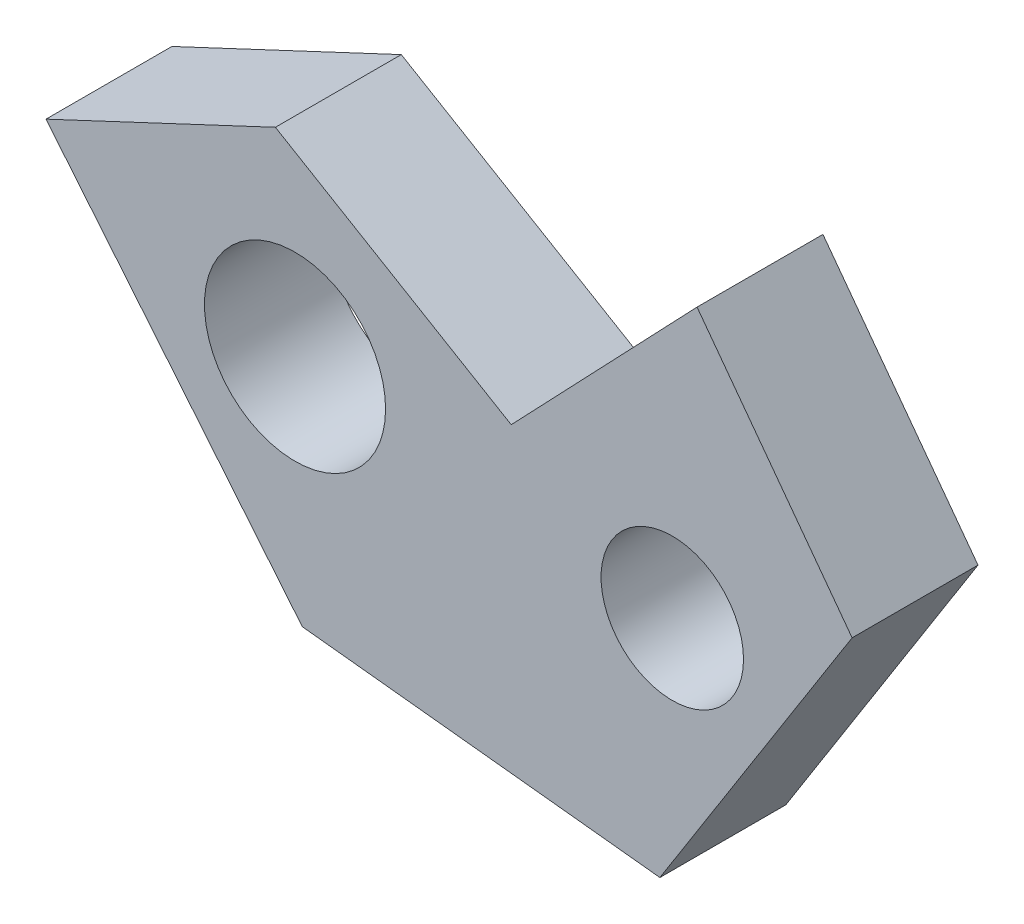
ISO-10303-21;
HEADER;
FILE_DESCRIPTION(('STEP AP214'),'2;1');
FILE_NAME('part.step','',(''),(''),'','','');
FILE_SCHEMA(('AUTOMOTIVE_DESIGN { 1 0 10303 214 1 1 1 1 }'));
ENDSEC;
DATA;
#1=APPLICATION_CONTEXT('core data for automotive mechanical design processes');
#2=APPLICATION_PROTOCOL_DEFINITION('international standard','automotive_design',2000,#1);
#3=PRODUCT_CONTEXT('',#1,'mechanical');
#4=PRODUCT('Part','Part','',(#3));
#5=PRODUCT_RELATED_PRODUCT_CATEGORY('part','',(#4));
#6=PRODUCT_DEFINITION_FORMATION('','',#4);
#7=PRODUCT_DEFINITION_CONTEXT('part definition',#1,'design');
#8=PRODUCT_DEFINITION('design','',#6,#7);
#9=PRODUCT_DEFINITION_SHAPE('','',#8);
#10=(LENGTH_UNIT() NAMED_UNIT(*) SI_UNIT(.MILLI.,.METRE.));
#11=(NAMED_UNIT(*) PLANE_ANGLE_UNIT() SI_UNIT($,.RADIAN.));
#12=(NAMED_UNIT(*) SI_UNIT($,.STERADIAN.) SOLID_ANGLE_UNIT());
#13=UNCERTAINTY_MEASURE_WITH_UNIT(LENGTH_MEASURE(1.E-05),#10,'distance_accuracy_value','');
#14=(GEOMETRIC_REPRESENTATION_CONTEXT(3) GLOBAL_UNCERTAINTY_ASSIGNED_CONTEXT((#13)) GLOBAL_UNIT_ASSIGNED_CONTEXT((#10,
#11,#12)) REPRESENTATION_CONTEXT('',''));
#15=CARTESIAN_POINT('',(0.,0.,0.));
#16=DIRECTION('',(0.,0.,1.));
#17=DIRECTION('',(1.,0.,0.));
#18=AXIS2_PLACEMENT_3D('',#15,#16,#17);
#19=CARTESIAN_POINT('',(-66.3761466597813,-92.8451621989578,40.));
#20=DIRECTION('',(0.772113642297999,0.635484479257612,0.));
#21=DIRECTION('',(-0.635484479257612,0.772113642297999,0.));
#22=AXIS2_PLACEMENT_3D('',#19,#20,#21);
#23=PLANE('',#22);
#24=DIRECTION('',(0.635484479257612,-0.772113642297999,0.));
#25=VECTOR('',#24,1.);
#26=CARTESIAN_POINT('',(-66.3761466597813,-92.8451621989578,0.));
#27=LINE('',#26,#25);
#28=CARTESIAN_POINT('',(-147.819271395709,6.10823435519459,0.));
#29=VERTEX_POINT('',#28);
#30=CARTESIAN_POINT('',(-66.3761466597813,-92.8451621989578,0.));
#31=VERTEX_POINT('',#30);
#32=EDGE_CURVE('E134',#29,#31,#27,.T.);
#33=ORIENTED_EDGE('',*,*,#32,.T.);
#34=DIRECTION('',(0.,0.,-1.));
#35=VECTOR('',#34,1.);
#36=CARTESIAN_POINT('',(-66.3761466597813,-92.8451621989578,40.));
#37=LINE('',#36,#35);
#38=CARTESIAN_POINT('',(-66.3761466597813,-92.8451621989578,40.));
#39=VERTEX_POINT('',#38);
#40=EDGE_CURVE('E11',#39,#31,#37,.T.);
#41=ORIENTED_EDGE('',*,*,#40,.F.);
#42=DIRECTION('',(0.635484479257612,-0.772113642297999,0.));
#43=VECTOR('',#42,1.);
#44=CARTESIAN_POINT('',(-66.3761466597813,-92.8451621989578,40.));
#45=LINE('',#44,#43);
#46=CARTESIAN_POINT('',(-147.819271395709,6.10823435519459,40.));
#47=VERTEX_POINT('',#46);
#48=EDGE_CURVE('E154',#47,#39,#45,.T.);
#49=ORIENTED_EDGE('',*,*,#48,.F.);
#50=DIRECTION('',(0.,0.,-1.));
#51=VECTOR('',#50,1.);
#52=CARTESIAN_POINT('',(-147.819271395709,6.10823435519459,40.));
#53=LINE('',#52,#51);
#54=EDGE_CURVE('E130',#47,#29,#53,.T.);
#55=ORIENTED_EDGE('',*,*,#54,.T.);
#56=EDGE_LOOP('',(#33,#41,#49,#55));
#57=FACE_BOUND('',#56,.T.);
#58=ADVANCED_FACE('F39',(#57),#23,.F.);
#59=CARTESIAN_POINT('',(47.2370123468381,-105.061630909347,40.));
#60=DIRECTION('',(0.10691060611702,0.994268636888287,0.));
#61=DIRECTION('',(-0.994268636888287,0.10691060611702,0.));
#62=AXIS2_PLACEMENT_3D('',#59,#60,#61);
#63=PLANE('',#62);
#64=DIRECTION('',(0.994268636888287,-0.10691060611702,0.));
#65=VECTOR('',#64,1.);
#66=CARTESIAN_POINT('',(47.2370123468381,-105.061630909347,0.));
#67=LINE('',#66,#65);
#68=CARTESIAN_POINT('',(47.2370123468381,-105.061630909347,0.));
#69=VERTEX_POINT('',#68);
#70=EDGE_CURVE('E138',#31,#69,#67,.T.);
#71=ORIENTED_EDGE('',*,*,#70,.T.);
#72=DIRECTION('',(0.,0.,-1.));
#73=VECTOR('',#72,1.);
#74=CARTESIAN_POINT('',(47.2370123468381,-105.061630909347,40.));
#75=LINE('',#74,#73);
#76=CARTESIAN_POINT('',(47.2370123468381,-105.061630909347,40.));
#77=VERTEX_POINT('',#76);
#78=EDGE_CURVE('E48',#77,#69,#75,.T.);
#79=ORIENTED_EDGE('',*,*,#78,.F.);
#80=DIRECTION('',(0.994268636888287,-0.10691060611702,0.));
#81=VECTOR('',#80,1.);
#82=CARTESIAN_POINT('',(47.2370123468381,-105.061630909347,40.));
#83=LINE('',#82,#81);
#84=EDGE_CURVE('E96',#39,#77,#83,.T.);
#85=ORIENTED_EDGE('',*,*,#84,.F.);
#86=ORIENTED_EDGE('',*,*,#40,.T.);
#87=EDGE_LOOP('',(#71,#79,#85,#86));
#88=FACE_BOUND('',#87,.T.);
#89=ADVANCED_FACE('F224',(#88),#63,.F.);
#90=CARTESIAN_POINT('',(108.319355898784,-8.55152809727244,40.));
#91=DIRECTION('',(-0.84498019748951,0.534797593347791,0.));
#92=DIRECTION('',(-0.534797593347791,-0.84498019748951,0.));
#93=AXIS2_PLACEMENT_3D('',#90,#91,#92);
#94=PLANE('',#93);
#95=DIRECTION('',(0.534797593347791,0.84498019748951,0.));
#96=VECTOR('',#95,1.);
#97=CARTESIAN_POINT('',(108.319355898784,-8.55152809727244,0.));
#98=LINE('',#97,#96);
#99=CARTESIAN_POINT('',(108.319355898784,-8.55152809727244,0.));
#100=VERTEX_POINT('',#99);
#101=EDGE_CURVE('E142',#69,#100,#98,.T.);
#102=ORIENTED_EDGE('',*,*,#101,.T.);
#103=DIRECTION('',(0.,0.,-1.));
#104=VECTOR('',#103,1.);
#105=CARTESIAN_POINT('',(108.319355898784,-8.55152809727244,40.));
#106=LINE('',#105,#104);
#107=CARTESIAN_POINT('',(108.319355898784,-8.55152809727244,40.));
#108=VERTEX_POINT('',#107);
#109=EDGE_CURVE('E161',#108,#100,#106,.T.);
#110=ORIENTED_EDGE('',*,*,#109,.F.);
#111=DIRECTION('',(0.534797593347791,0.84498019748951,0.));
#112=VECTOR('',#111,1.);
#113=CARTESIAN_POINT('',(108.319355898784,-8.55152809727244,40.));
#114=LINE('',#113,#112);
#115=EDGE_CURVE('E171',#77,#108,#114,.T.);
#116=ORIENTED_EDGE('',*,*,#115,.F.);
#117=ORIENTED_EDGE('',*,*,#78,.T.);
#118=EDGE_LOOP('',(#102,#110,#116,#117));
#119=FACE_BOUND('',#118,.T.);
#120=ADVANCED_FACE('F169',(#119),#94,.F.);
#121=CARTESIAN_POINT('',(59.0462654335477,57.8246185625088,40.));
#122=DIRECTION('',(-0.802945922722565,-0.596051881284849,0.));
#123=DIRECTION('',(0.596051881284849,-0.802945922722566,0.));
#124=AXIS2_PLACEMENT_3D('',#121,#122,#123);
#125=PLANE('',#124);
#126=DIRECTION('',(-0.596051881284849,0.802945922722565,0.));
#127=VECTOR('',#126,1.);
#128=CARTESIAN_POINT('',(59.0462654335477,57.8246185625088,0.));
#129=LINE('',#128,#127);
#130=CARTESIAN_POINT('',(59.0462654335477,57.8246185625088,0.));
#131=VERTEX_POINT('',#130);
#132=EDGE_CURVE('E145',#100,#131,#129,.T.);
#133=ORIENTED_EDGE('',*,*,#132,.T.);
#134=DIRECTION('',(0.,0.,-1.));
#135=VECTOR('',#134,1.);
#136=CARTESIAN_POINT('',(59.0462654335477,57.8246185625088,40.));
#137=LINE('',#136,#135);
#138=CARTESIAN_POINT('',(59.0462654335477,57.8246185625088,40.));
#139=VERTEX_POINT('',#138);
#140=EDGE_CURVE('E123',#139,#131,#137,.T.);
#141=ORIENTED_EDGE('',*,*,#140,.F.);
#142=DIRECTION('',(-0.596051881284849,0.802945922722565,0.));
#143=VECTOR('',#142,1.);
#144=CARTESIAN_POINT('',(59.0462654335477,57.8246185625088,40.));
#145=LINE('',#144,#143);
#146=EDGE_CURVE('E112',#108,#139,#145,.T.);
#147=ORIENTED_EDGE('',*,*,#146,.F.);
#148=ORIENTED_EDGE('',*,*,#109,.T.);
#149=EDGE_LOOP('',(#133,#141,#147,#148));
#150=FACE_BOUND('',#149,.T.);
#151=ADVANCED_FACE('F177',(#150),#125,.F.);
#152=CARTESIAN_POINT('',(0.,-4.0721562367964,40.));
#153=DIRECTION('',(0.723571653861513,-0.690249275065259,0.));
#154=DIRECTION('',(0.690249275065259,0.723571653861513,0.));
#155=AXIS2_PLACEMENT_3D('',#152,#153,#154);
#156=PLANE('',#155);
#157=DIRECTION('',(-0.690249275065258,-0.723571653861513,0.));
#158=VECTOR('',#157,1.);
#159=CARTESIAN_POINT('',(0.,-4.0721562367964,0.));
#160=LINE('',#159,#158);
#161=CARTESIAN_POINT('',(0.,-4.0721562367964,0.));
#162=VERTEX_POINT('',#161);
#163=EDGE_CURVE('E121',#131,#162,#160,.T.);
#164=ORIENTED_EDGE('',*,*,#163,.T.);
#165=DIRECTION('',(0.,0.,-1.));
#166=VECTOR('',#165,1.);
#167=CARTESIAN_POINT('',(0.,-4.0721562367964,40.));
#168=LINE('',#167,#166);
#169=CARTESIAN_POINT('',(0.,-4.0721562367964,40.));
#170=VERTEX_POINT('',#169);
#171=EDGE_CURVE('E118',#170,#162,#168,.T.);
#172=ORIENTED_EDGE('',*,*,#171,.F.);
#173=DIRECTION('',(-0.690249275065258,-0.723571653861513,0.));
#174=VECTOR('',#173,1.);
#175=CARTESIAN_POINT('',(0.,-4.0721562367964,40.));
#176=LINE('',#175,#174);
#177=EDGE_CURVE('E106',#139,#170,#176,.T.);
#178=ORIENTED_EDGE('',*,*,#177,.F.);
#179=ORIENTED_EDGE('',*,*,#140,.T.);
#180=EDGE_LOOP('',(#164,#172,#178,#179));
#181=FACE_BOUND('',#180,.T.);
#182=ADVANCED_FACE('F119',(#181),#156,.F.);
#183=CARTESIAN_POINT('',(-74.9276747570537,40.3143467442843,40.));
#184=DIRECTION('',(-0.509674212485728,-0.86036747795756,0.));
#185=DIRECTION('',(0.86036747795756,-0.509674212485728,0.));
#186=AXIS2_PLACEMENT_3D('',#183,#184,#185);
#187=PLANE('',#186);
#188=DIRECTION('',(-0.86036747795756,0.509674212485728,0.));
#189=VECTOR('',#188,1.);
#190=CARTESIAN_POINT('',(-74.9276747570537,40.3143467442843,0.));
#191=LINE('',#190,#189);
#192=CARTESIAN_POINT('',(-74.9276747570537,40.3143467442843,0.));
#193=VERTEX_POINT('',#192);
#194=EDGE_CURVE('E82',#162,#193,#191,.T.);
#195=ORIENTED_EDGE('',*,*,#194,.T.);
#196=DIRECTION('',(0.,0.,-1.));
#197=VECTOR('',#196,1.);
#198=CARTESIAN_POINT('',(-74.9276747570537,40.3143467442843,40.));
#199=LINE('',#198,#197);
#200=CARTESIAN_POINT('',(-74.9276747570537,40.3143467442843,40.));
#201=VERTEX_POINT('',#200);
#202=EDGE_CURVE('E124',#201,#193,#199,.T.);
#203=ORIENTED_EDGE('',*,*,#202,.F.);
#204=DIRECTION('',(-0.86036747795756,0.509674212485728,0.));
#205=VECTOR('',#204,1.);
#206=CARTESIAN_POINT('',(-74.9276747570537,40.3143467442843,40.));
#207=LINE('',#206,#205);
#208=EDGE_CURVE('E110',#170,#201,#207,.T.);
#209=ORIENTED_EDGE('',*,*,#208,.F.);
#210=ORIENTED_EDGE('',*,*,#171,.T.);
#211=EDGE_LOOP('',(#195,#203,#209,#210));
#212=FACE_BOUND('',#211,.T.);
#213=ADVANCED_FACE('F126',(#212),#187,.F.);
#214=CARTESIAN_POINT('',(-147.819271395709,6.10823435519459,40.));
#215=DIRECTION('',(0.424822557289492,-0.905276639938321,0.));
#216=DIRECTION('',(0.905276639938321,0.424822557289492,0.));
#217=AXIS2_PLACEMENT_3D('',#214,#215,#216);
#218=PLANE('',#217);
#219=DIRECTION('',(-0.905276639938321,-0.424822557289491,0.));
#220=VECTOR('',#219,1.);
#221=CARTESIAN_POINT('',(-147.819271395709,6.10823435519459,0.));
#222=LINE('',#221,#220);
#223=EDGE_CURVE('E88',#193,#29,#222,.T.);
#224=ORIENTED_EDGE('',*,*,#223,.T.);
#225=ORIENTED_EDGE('',*,*,#54,.F.);
#226=DIRECTION('',(-0.905276639938321,-0.424822557289491,0.));
#227=VECTOR('',#226,1.);
#228=CARTESIAN_POINT('',(-147.819271395709,6.10823435519459,40.));
#229=LINE('',#228,#227);
#230=EDGE_CURVE('E56',#201,#47,#229,.T.);
#231=ORIENTED_EDGE('',*,*,#230,.F.);
#232=ORIENTED_EDGE('',*,*,#202,.T.);
#233=EDGE_LOOP('',(#224,#225,#231,#232));
#234=FACE_BOUND('',#233,.T.);
#235=ADVANCED_FACE('F207',(#234),#218,.F.);
#236=CARTESIAN_POINT('',(0.,0.,40.));
#237=DIRECTION('',(0.,0.,-1.));
#238=DIRECTION('',(-1.,0.,0.));
#239=AXIS2_PLACEMENT_3D('',#236,#237,#238);
#240=PLANE('',#239);
#241=CARTESIAN_POINT('',(51.1795113417773,-31.7322492826271,40.));
#242=DIRECTION('',(0.,0.,1.));
#243=DIRECTION('',(1.,0.,0.));
#244=AXIS2_PLACEMENT_3D('',#241,#242,#243);
#245=CIRCLE('',#244,22.6318479182267);
#246=CARTESIAN_POINT('',(73.8113592600039,-31.7322492826271,40.));
#247=VERTEX_POINT('',#246);
#248=EDGE_CURVE('E190',#247,#247,#245,.T.);
#249=ORIENTED_EDGE('',*,*,#248,.F.);
#250=EDGE_LOOP('',(#249));
#251=FACE_BOUND('',#250,.T.);
#252=CARTESIAN_POINT('',(-68.6954393428971,-19.7032749924695,40.));
#253=DIRECTION('',(0.,0.,1.));
#254=DIRECTION('',(1.,0.,0.));
#255=AXIS2_PLACEMENT_3D('',#252,#253,#254);
#256=CIRCLE('',#255,28.7765370215644);
#257=CARTESIAN_POINT('',(-39.9189023213327,-19.7032749924695,40.));
#258=VERTEX_POINT('',#257);
#259=EDGE_CURVE('E191',#258,#258,#256,.T.);
#260=ORIENTED_EDGE('',*,*,#259,.F.);
#261=EDGE_LOOP('',(#260));
#262=FACE_BOUND('',#261,.T.);
#263=ORIENTED_EDGE('',*,*,#48,.T.);
#264=ORIENTED_EDGE('',*,*,#84,.T.);
#265=ORIENTED_EDGE('',*,*,#115,.T.);
#266=ORIENTED_EDGE('',*,*,#146,.T.);
#267=ORIENTED_EDGE('',*,*,#177,.T.);
#268=ORIENTED_EDGE('',*,*,#208,.T.);
#269=ORIENTED_EDGE('',*,*,#230,.T.);
#270=EDGE_LOOP('',(#263,#264,#265,#266,#267,#268,#269));
#271=FACE_BOUND('',#270,.T.);
#272=ADVANCED_FACE('F108',(#251,#262,#271),#240,.F.);
#273=CARTESIAN_POINT('',(0.,0.,0.));
#274=DIRECTION('',(0.,0.,-1.));
#275=DIRECTION('',(-1.,0.,0.));
#276=AXIS2_PLACEMENT_3D('',#273,#274,#275);
#277=PLANE('',#276);
#278=CARTESIAN_POINT('',(51.1795113417773,-31.7322492826271,0.));
#279=DIRECTION('',(0.,0.,-1.));
#280=DIRECTION('',(-1.,0.,0.));
#281=AXIS2_PLACEMENT_3D('',#278,#279,#280);
#282=CIRCLE('',#281,22.6318479182267);
#283=CARTESIAN_POINT('',(28.5476634235506,-31.7322492826271,0.));
#284=VERTEX_POINT('',#283);
#285=EDGE_CURVE('E139',#284,#284,#282,.F.);
#286=ORIENTED_EDGE('',*,*,#285,.T.);
#287=EDGE_LOOP('',(#286));
#288=FACE_BOUND('',#287,.T.);
#289=CARTESIAN_POINT('',(-68.6954393428971,-19.7032749924695,0.));
#290=DIRECTION('',(0.,0.,-1.));
#291=DIRECTION('',(-1.,0.,0.));
#292=AXIS2_PLACEMENT_3D('',#289,#290,#291);
#293=CIRCLE('',#292,28.7765370215644);
#294=CARTESIAN_POINT('',(-97.4719763644615,-19.7032749924695,0.));
#295=VERTEX_POINT('',#294);
#296=EDGE_CURVE('E186',#295,#295,#293,.F.);
#297=ORIENTED_EDGE('',*,*,#296,.T.);
#298=EDGE_LOOP('',(#297));
#299=FACE_BOUND('',#298,.T.);
#300=ORIENTED_EDGE('',*,*,#32,.F.);
#301=ORIENTED_EDGE('',*,*,#223,.F.);
#302=ORIENTED_EDGE('',*,*,#194,.F.);
#303=ORIENTED_EDGE('',*,*,#163,.F.);
#304=ORIENTED_EDGE('',*,*,#132,.F.);
#305=ORIENTED_EDGE('',*,*,#101,.F.);
#306=ORIENTED_EDGE('',*,*,#70,.F.);
#307=EDGE_LOOP('',(#300,#301,#302,#303,#304,#305,#306));
#308=FACE_BOUND('',#307,.T.);
#309=ADVANCED_FACE('F175',(#288,#299,#308),#277,.T.);
#310=CARTESIAN_POINT('',(-68.6954393428971,-19.7032749924695,-81.3923378680557));
#311=DIRECTION('',(0.,0.,1.));
#312=DIRECTION('',(1.,0.,0.));
#313=AXIS2_PLACEMENT_3D('',#310,#311,#312);
#314=CYLINDRICAL_SURFACE('',#313,28.7765370215644);
#315=ORIENTED_EDGE('',*,*,#259,.T.);
#316=EDGE_LOOP('',(#315));
#317=FACE_BOUND('',#316,.T.);
#318=ORIENTED_EDGE('',*,*,#296,.F.);
#319=EDGE_LOOP('',(#318));
#320=FACE_BOUND('',#319,.T.);
#321=ADVANCED_FACE('F211',(#317,#320),#314,.F.);
#322=CARTESIAN_POINT('',(51.1795113417773,-31.7322492826271,-81.3923378680557));
#323=DIRECTION('',(0.,0.,1.));
#324=DIRECTION('',(1.,0.,0.));
#325=AXIS2_PLACEMENT_3D('',#322,#323,#324);
#326=CYLINDRICAL_SURFACE('',#325,22.6318479182267);
#327=ORIENTED_EDGE('',*,*,#248,.T.);
#328=EDGE_LOOP('',(#327));
#329=FACE_BOUND('',#328,.T.);
#330=ORIENTED_EDGE('',*,*,#285,.F.);
#331=EDGE_LOOP('',(#330));
#332=FACE_BOUND('',#331,.T.);
#333=ADVANCED_FACE('F202',(#329,#332),#326,.F.);
#334=CLOSED_SHELL('',(#58,#89,#120,#151,#182,#213,#235,#272,#309,#321,#333));
#335=MANIFOLD_SOLID_BREP('B2',#334);
#336=ADVANCED_BREP_SHAPE_REPRESENTATION('',(#18,#335),#14);
#337=SHAPE_DEFINITION_REPRESENTATION(#9,#336);
ENDSEC;
END-ISO-10303-21;
